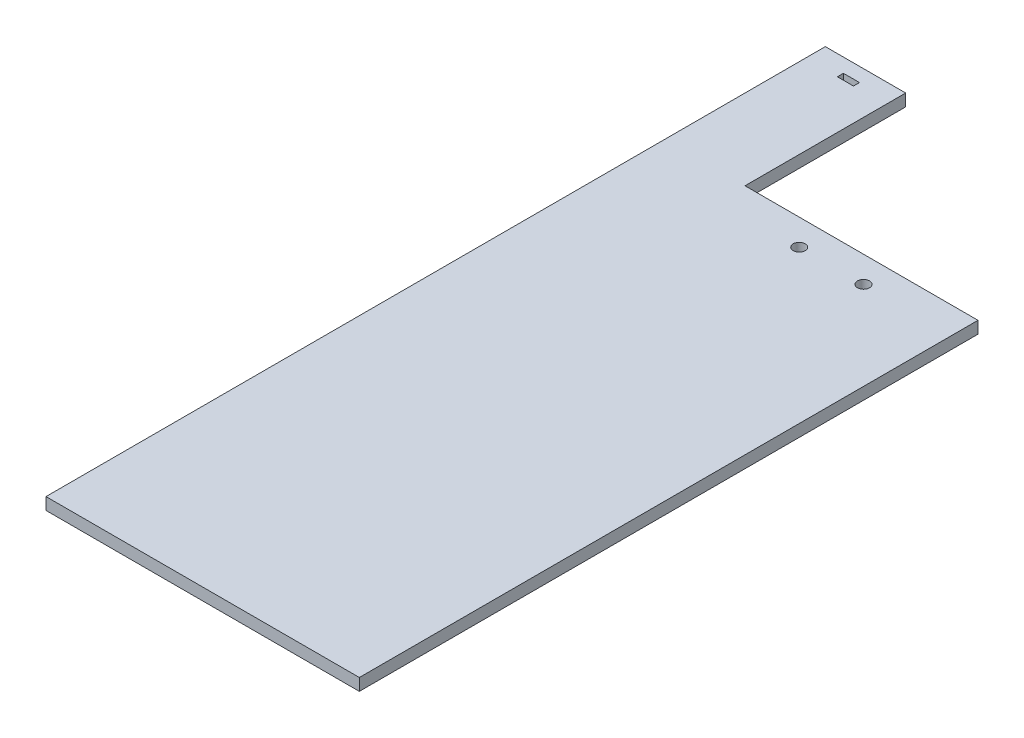
ISO-10303-21;
HEADER;
FILE_DESCRIPTION(('STEP AP214'),'2;1');
FILE_NAME('part.step','',(''),(''),'','','');
FILE_SCHEMA(('AUTOMOTIVE_DESIGN { 1 0 10303 214 1 1 1 1 }'));
ENDSEC;
DATA;
#1=APPLICATION_CONTEXT('core data for automotive mechanical design processes');
#2=APPLICATION_PROTOCOL_DEFINITION('international standard','automotive_design',2000,#1);
#3=PRODUCT_CONTEXT('',#1,'mechanical');
#4=PRODUCT('Part','Part','',(#3));
#5=PRODUCT_RELATED_PRODUCT_CATEGORY('part','',(#4));
#6=PRODUCT_DEFINITION_FORMATION('','',#4);
#7=PRODUCT_DEFINITION_CONTEXT('part definition',#1,'design');
#8=PRODUCT_DEFINITION('design','',#6,#7);
#9=PRODUCT_DEFINITION_SHAPE('','',#8);
#10=(LENGTH_UNIT() NAMED_UNIT(*) SI_UNIT(.MILLI.,.METRE.));
#11=(NAMED_UNIT(*) PLANE_ANGLE_UNIT() SI_UNIT($,.RADIAN.));
#12=(NAMED_UNIT(*) SI_UNIT($,.STERADIAN.) SOLID_ANGLE_UNIT());
#13=UNCERTAINTY_MEASURE_WITH_UNIT(LENGTH_MEASURE(1.E-05),#10,'distance_accuracy_value','');
#14=(GEOMETRIC_REPRESENTATION_CONTEXT(3) GLOBAL_UNCERTAINTY_ASSIGNED_CONTEXT((#13)) GLOBAL_UNIT_ASSIGNED_CONTEXT((#10,
#11,#12)) REPRESENTATION_CONTEXT('',''));
#15=CARTESIAN_POINT('',(0.,0.,0.));
#16=DIRECTION('',(0.,0.,1.));
#17=DIRECTION('',(1.,0.,0.));
#18=AXIS2_PLACEMENT_3D('',#15,#16,#17);
#19=CARTESIAN_POINT('',(0.,3.,0.));
#20=DIRECTION('',(0.,-1.,0.));
#21=DIRECTION('',(0.,0.,-1.));
#22=AXIS2_PLACEMENT_3D('',#19,#20,#21);
#23=PLANE('',#22);
#24=CARTESIAN_POINT('',(40.,3.,-147.5));
#25=DIRECTION('',(0.,1.,0.));
#26=DIRECTION('',(0.,0.,1.));
#27=AXIS2_PLACEMENT_3D('',#24,#25,#26);
#28=CIRCLE('',#27,1.50000000000002);
#29=CARTESIAN_POINT('',(40.,3.,-146.));
#30=VERTEX_POINT('',#29);
#31=EDGE_CURVE('E189',#30,#30,#28,.T.);
#32=ORIENTED_EDGE('',*,*,#31,.F.);
#33=EDGE_LOOP('',(#32));
#34=FACE_BOUND('',#33,.T.);
#35=CARTESIAN_POINT('',(56.,3.,-147.5));
#36=DIRECTION('',(0.,1.,0.));
#37=DIRECTION('',(0.,0.,1.));
#38=AXIS2_PLACEMENT_3D('',#35,#36,#37);
#39=CIRCLE('',#38,1.49999999999998);
#40=CARTESIAN_POINT('',(56.,3.,-146.));
#41=VERTEX_POINT('',#40);
#42=EDGE_CURVE('E196',#41,#41,#39,.T.);
#43=ORIENTED_EDGE('',*,*,#42,.F.);
#44=EDGE_LOOP('',(#43));
#45=FACE_BOUND('',#44,.T.);
#46=DIRECTION('',(1.,0.,0.));
#47=VECTOR('',#46,1.);
#48=CARTESIAN_POINT('',(0.,3.,0.));
#49=LINE('',#48,#47);
#50=CARTESIAN_POINT('',(0.,3.,0.));
#51=VERTEX_POINT('',#50);
#52=CARTESIAN_POINT('',(78.,3.,0.));
#53=VERTEX_POINT('',#52);
#54=EDGE_CURVE('E133',#51,#53,#49,.T.);
#55=ORIENTED_EDGE('',*,*,#54,.T.);
#56=DIRECTION('',(0.,0.,1.));
#57=VECTOR('',#56,1.);
#58=CARTESIAN_POINT('',(78.,3.,-194.));
#59=LINE('',#58,#57);
#60=CARTESIAN_POINT('',(78.,3.,-154.));
#61=VERTEX_POINT('',#60);
#62=EDGE_CURVE('E121',#61,#53,#59,.T.);
#63=ORIENTED_EDGE('',*,*,#62,.F.);
#64=DIRECTION('',(-1.,0.,0.));
#65=VECTOR('',#64,1.);
#66=CARTESIAN_POINT('',(20.,3.,-154.));
#67=LINE('',#66,#65);
#68=CARTESIAN_POINT('',(20.,3.,-154.));
#69=VERTEX_POINT('',#68);
#70=EDGE_CURVE('E144',#61,#69,#67,.T.);
#71=ORIENTED_EDGE('',*,*,#70,.T.);
#72=DIRECTION('',(0.,0.,-1.));
#73=VECTOR('',#72,1.);
#74=CARTESIAN_POINT('',(20.,3.,-194.));
#75=LINE('',#74,#73);
#76=CARTESIAN_POINT('',(20.,3.,-194.));
#77=VERTEX_POINT('',#76);
#78=EDGE_CURVE('E148',#69,#77,#75,.T.);
#79=ORIENTED_EDGE('',*,*,#78,.T.);
#80=DIRECTION('',(-1.,0.,0.));
#81=VECTOR('',#80,1.);
#82=CARTESIAN_POINT('',(0.,3.,-194.));
#83=LINE('',#82,#81);
#84=CARTESIAN_POINT('',(0.,3.,-194.));
#85=VERTEX_POINT('',#84);
#86=EDGE_CURVE('E156',#77,#85,#83,.T.);
#87=ORIENTED_EDGE('',*,*,#86,.T.);
#88=DIRECTION('',(0.,0.,1.));
#89=VECTOR('',#88,1.);
#90=CARTESIAN_POINT('',(0.,3.,0.));
#91=LINE('',#90,#89);
#92=EDGE_CURVE('E141',#85,#51,#91,.T.);
#93=ORIENTED_EDGE('',*,*,#92,.T.);
#94=EDGE_LOOP('',(#55,#63,#71,#79,#87,#93));
#95=FACE_BOUND('',#94,.T.);
#96=DIRECTION('',(0.,0.,1.));
#97=VECTOR('',#96,1.);
#98=CARTESIAN_POINT('',(8.,3.,-190.5));
#99=LINE('',#98,#97);
#100=CARTESIAN_POINT('',(8.,3.,-190.5));
#101=VERTEX_POINT('',#100);
#102=CARTESIAN_POINT('',(8.,3.,-189.));
#103=VERTEX_POINT('',#102);
#104=EDGE_CURVE('E207',#101,#103,#99,.T.);
#105=ORIENTED_EDGE('',*,*,#104,.F.);
#106=DIRECTION('',(-1.,0.,0.));
#107=VECTOR('',#106,1.);
#108=CARTESIAN_POINT('',(8.,3.,-190.5));
#109=LINE('',#108,#107);
#110=CARTESIAN_POINT('',(12.,3.,-190.5));
#111=VERTEX_POINT('',#110);
#112=EDGE_CURVE('E217',#111,#101,#109,.T.);
#113=ORIENTED_EDGE('',*,*,#112,.F.);
#114=DIRECTION('',(0.,0.,-1.));
#115=VECTOR('',#114,1.);
#116=CARTESIAN_POINT('',(12.,3.,-190.5));
#117=LINE('',#116,#115);
#118=CARTESIAN_POINT('',(12.,3.,-189.));
#119=VERTEX_POINT('',#118);
#120=EDGE_CURVE('E214',#119,#111,#117,.T.);
#121=ORIENTED_EDGE('',*,*,#120,.F.);
#122=DIRECTION('',(1.,0.,0.));
#123=VECTOR('',#122,1.);
#124=CARTESIAN_POINT('',(8.,3.,-189.));
#125=LINE('',#124,#123);
#126=EDGE_CURVE('E210',#103,#119,#125,.T.);
#127=ORIENTED_EDGE('',*,*,#126,.F.);
#128=EDGE_LOOP('',(#105,#113,#121,#127));
#129=FACE_BOUND('',#128,.T.);
#130=ADVANCED_FACE('F44',(#34,#45,#95,#129),#23,.F.);
#131=CARTESIAN_POINT('',(0.,0.,0.));
#132=DIRECTION('',(0.,-1.,0.));
#133=DIRECTION('',(0.,0.,-1.));
#134=AXIS2_PLACEMENT_3D('',#131,#132,#133);
#135=PLANE('',#134);
#136=CARTESIAN_POINT('',(40.,0.,-147.5));
#137=DIRECTION('',(0.,-1.,0.));
#138=DIRECTION('',(0.,0.,-1.));
#139=AXIS2_PLACEMENT_3D('',#136,#137,#138);
#140=CIRCLE('',#139,1.50000000000002);
#141=CARTESIAN_POINT('',(40.,0.,-149.));
#142=VERTEX_POINT('',#141);
#143=EDGE_CURVE('E48',#142,#142,#140,.T.);
#144=ORIENTED_EDGE('',*,*,#143,.F.);
#145=EDGE_LOOP('',(#144));
#146=FACE_BOUND('',#145,.T.);
#147=CARTESIAN_POINT('',(56.,0.,-147.5));
#148=DIRECTION('',(0.,-1.,0.));
#149=DIRECTION('',(0.,0.,-1.));
#150=AXIS2_PLACEMENT_3D('',#147,#148,#149);
#151=CIRCLE('',#150,1.49999999999998);
#152=CARTESIAN_POINT('',(56.,0.,-149.));
#153=VERTEX_POINT('',#152);
#154=EDGE_CURVE('E186',#153,#153,#151,.T.);
#155=ORIENTED_EDGE('',*,*,#154,.F.);
#156=EDGE_LOOP('',(#155));
#157=FACE_BOUND('',#156,.T.);
#158=DIRECTION('',(0.,0.,1.));
#159=VECTOR('',#158,1.);
#160=CARTESIAN_POINT('',(78.,0.,-194.));
#161=LINE('',#160,#159);
#162=CARTESIAN_POINT('',(78.,0.,-154.));
#163=VERTEX_POINT('',#162);
#164=CARTESIAN_POINT('',(78.,0.,0.));
#165=VERTEX_POINT('',#164);
#166=EDGE_CURVE('E62',#163,#165,#161,.T.);
#167=ORIENTED_EDGE('',*,*,#166,.T.);
#168=DIRECTION('',(1.,0.,0.));
#169=VECTOR('',#168,1.);
#170=CARTESIAN_POINT('',(0.,0.,0.));
#171=LINE('',#170,#169);
#172=CARTESIAN_POINT('',(0.,0.,0.));
#173=VERTEX_POINT('',#172);
#174=EDGE_CURVE('E136',#173,#165,#171,.T.);
#175=ORIENTED_EDGE('',*,*,#174,.F.);
#176=DIRECTION('',(0.,0.,1.));
#177=VECTOR('',#176,1.);
#178=CARTESIAN_POINT('',(0.,0.,-154.));
#179=LINE('',#178,#177);
#180=CARTESIAN_POINT('',(0.,0.,-194.));
#181=VERTEX_POINT('',#180);
#182=EDGE_CURVE('E150',#181,#173,#179,.T.);
#183=ORIENTED_EDGE('',*,*,#182,.F.);
#184=DIRECTION('',(-1.,0.,0.));
#185=VECTOR('',#184,1.);
#186=CARTESIAN_POINT('',(0.,0.,-194.));
#187=LINE('',#186,#185);
#188=CARTESIAN_POINT('',(20.,0.,-194.));
#189=VERTEX_POINT('',#188);
#190=EDGE_CURVE('E169',#189,#181,#187,.T.);
#191=ORIENTED_EDGE('',*,*,#190,.F.);
#192=DIRECTION('',(0.,0.,-1.));
#193=VECTOR('',#192,1.);
#194=CARTESIAN_POINT('',(20.,0.,-194.));
#195=LINE('',#194,#193);
#196=CARTESIAN_POINT('',(20.,0.,-154.));
#197=VERTEX_POINT('',#196);
#198=EDGE_CURVE('E166',#197,#189,#195,.T.);
#199=ORIENTED_EDGE('',*,*,#198,.F.);
#200=DIRECTION('',(-1.,0.,0.));
#201=VECTOR('',#200,1.);
#202=CARTESIAN_POINT('',(20.,0.,-154.));
#203=LINE('',#202,#201);
#204=EDGE_CURVE('E162',#163,#197,#203,.T.);
#205=ORIENTED_EDGE('',*,*,#204,.F.);
#206=EDGE_LOOP('',(#167,#175,#183,#191,#199,#205));
#207=FACE_BOUND('',#206,.T.);
#208=DIRECTION('',(-1.,0.,0.));
#209=VECTOR('',#208,1.);
#210=CARTESIAN_POINT('',(8.,0.,-190.5));
#211=LINE('',#210,#209);
#212=CARTESIAN_POINT('',(12.,0.,-190.5));
#213=VERTEX_POINT('',#212);
#214=CARTESIAN_POINT('',(8.,0.,-190.5));
#215=VERTEX_POINT('',#214);
#216=EDGE_CURVE('E211',#213,#215,#211,.T.);
#217=ORIENTED_EDGE('',*,*,#216,.T.);
#218=DIRECTION('',(0.,0.,1.));
#219=VECTOR('',#218,1.);
#220=CARTESIAN_POINT('',(8.,0.,-190.5));
#221=LINE('',#220,#219);
#222=CARTESIAN_POINT('',(8.,0.,-189.));
#223=VERTEX_POINT('',#222);
#224=EDGE_CURVE('E205',#215,#223,#221,.T.);
#225=ORIENTED_EDGE('',*,*,#224,.T.);
#226=DIRECTION('',(1.,0.,0.));
#227=VECTOR('',#226,1.);
#228=CARTESIAN_POINT('',(8.,0.,-189.));
#229=LINE('',#228,#227);
#230=CARTESIAN_POINT('',(12.,0.,-189.));
#231=VERTEX_POINT('',#230);
#232=EDGE_CURVE('E224',#223,#231,#229,.T.);
#233=ORIENTED_EDGE('',*,*,#232,.T.);
#234=DIRECTION('',(0.,0.,-1.));
#235=VECTOR('',#234,1.);
#236=CARTESIAN_POINT('',(12.,0.,-190.5));
#237=LINE('',#236,#235);
#238=EDGE_CURVE('E228',#231,#213,#237,.T.);
#239=ORIENTED_EDGE('',*,*,#238,.T.);
#240=EDGE_LOOP('',(#217,#225,#233,#239));
#241=FACE_BOUND('',#240,.T.);
#242=ADVANCED_FACE('F252',(#146,#157,#207,#241),#135,.T.);
#243=CARTESIAN_POINT('',(0.,3.,0.));
#244=DIRECTION('',(0.,0.,-1.));
#245=DIRECTION('',(-1.,0.,0.));
#246=AXIS2_PLACEMENT_3D('',#243,#244,#245);
#247=PLANE('',#246);
#248=ORIENTED_EDGE('',*,*,#174,.T.);
#249=DIRECTION('',(0.,-1.,0.));
#250=VECTOR('',#249,1.);
#251=CARTESIAN_POINT('',(78.,0.,0.));
#252=LINE('',#251,#250);
#253=EDGE_CURVE('E124',#53,#165,#252,.T.);
#254=ORIENTED_EDGE('',*,*,#253,.F.);
#255=ORIENTED_EDGE('',*,*,#54,.F.);
#256=DIRECTION('',(0.,-1.,0.));
#257=VECTOR('',#256,1.);
#258=CARTESIAN_POINT('',(0.,3.,0.));
#259=LINE('',#258,#257);
#260=EDGE_CURVE('E54',#51,#173,#259,.T.);
#261=ORIENTED_EDGE('',*,*,#260,.T.);
#262=EDGE_LOOP('',(#248,#254,#255,#261));
#263=FACE_BOUND('',#262,.T.);
#264=ADVANCED_FACE('F46',(#263),#247,.F.);
#265=CARTESIAN_POINT('',(20.,3.,-154.));
#266=DIRECTION('',(0.,0.,1.));
#267=DIRECTION('',(1.,0.,0.));
#268=AXIS2_PLACEMENT_3D('',#265,#266,#267);
#269=PLANE('',#268);
#270=ORIENTED_EDGE('',*,*,#70,.F.);
#271=DIRECTION('',(0.,-1.,0.));
#272=VECTOR('',#271,1.);
#273=CARTESIAN_POINT('',(78.,3.,-154.));
#274=LINE('',#273,#272);
#275=EDGE_CURVE('E11',#61,#163,#274,.T.);
#276=ORIENTED_EDGE('',*,*,#275,.T.);
#277=ORIENTED_EDGE('',*,*,#204,.T.);
#278=DIRECTION('',(0.,-1.,0.));
#279=VECTOR('',#278,1.);
#280=CARTESIAN_POINT('',(20.,3.,-154.));
#281=LINE('',#280,#279);
#282=EDGE_CURVE('E181',#69,#197,#281,.T.);
#283=ORIENTED_EDGE('',*,*,#282,.F.);
#284=EDGE_LOOP('',(#270,#276,#277,#283));
#285=FACE_BOUND('',#284,.T.);
#286=ADVANCED_FACE('F291',(#285),#269,.F.);
#287=CARTESIAN_POINT('',(20.,3.,-194.));
#288=DIRECTION('',(-1.,0.,0.));
#289=DIRECTION('',(0.,0.,1.));
#290=AXIS2_PLACEMENT_3D('',#287,#288,#289);
#291=PLANE('',#290);
#292=ORIENTED_EDGE('',*,*,#198,.T.);
#293=DIRECTION('',(0.,-1.,0.));
#294=VECTOR('',#293,1.);
#295=CARTESIAN_POINT('',(20.,3.,-194.));
#296=LINE('',#295,#294);
#297=EDGE_CURVE('E177',#77,#189,#296,.T.);
#298=ORIENTED_EDGE('',*,*,#297,.F.);
#299=ORIENTED_EDGE('',*,*,#78,.F.);
#300=ORIENTED_EDGE('',*,*,#282,.T.);
#301=EDGE_LOOP('',(#292,#298,#299,#300));
#302=FACE_BOUND('',#301,.T.);
#303=ADVANCED_FACE('F288',(#302),#291,.F.);
#304=CARTESIAN_POINT('',(0.,3.,-194.));
#305=DIRECTION('',(0.,0.,1.));
#306=DIRECTION('',(1.,0.,0.));
#307=AXIS2_PLACEMENT_3D('',#304,#305,#306);
#308=PLANE('',#307);
#309=ORIENTED_EDGE('',*,*,#190,.T.);
#310=DIRECTION('',(0.,-1.,0.));
#311=VECTOR('',#310,1.);
#312=CARTESIAN_POINT('',(0.,3.,-194.));
#313=LINE('',#312,#311);
#314=EDGE_CURVE('E159',#85,#181,#313,.T.);
#315=ORIENTED_EDGE('',*,*,#314,.F.);
#316=ORIENTED_EDGE('',*,*,#86,.F.);
#317=ORIENTED_EDGE('',*,*,#297,.T.);
#318=EDGE_LOOP('',(#309,#315,#316,#317));
#319=FACE_BOUND('',#318,.T.);
#320=ADVANCED_FACE('F284',(#319),#308,.F.);
#321=CARTESIAN_POINT('',(0.,3.,-154.));
#322=DIRECTION('',(1.,0.,0.));
#323=DIRECTION('',(0.,0.,-1.));
#324=AXIS2_PLACEMENT_3D('',#321,#322,#323);
#325=PLANE('',#324);
#326=ORIENTED_EDGE('',*,*,#182,.T.);
#327=ORIENTED_EDGE('',*,*,#260,.F.);
#328=ORIENTED_EDGE('',*,*,#92,.F.);
#329=ORIENTED_EDGE('',*,*,#314,.T.);
#330=EDGE_LOOP('',(#326,#327,#328,#329));
#331=FACE_BOUND('',#330,.T.);
#332=ADVANCED_FACE('F281',(#331),#325,.F.);
#333=CARTESIAN_POINT('',(8.,3.,-190.5));
#334=DIRECTION('',(1.,0.,0.));
#335=DIRECTION('',(0.,0.,-1.));
#336=AXIS2_PLACEMENT_3D('',#333,#334,#335);
#337=PLANE('',#336);
#338=ORIENTED_EDGE('',*,*,#224,.F.);
#339=DIRECTION('',(0.,-1.,0.));
#340=VECTOR('',#339,1.);
#341=CARTESIAN_POINT('',(8.,3.,-190.5));
#342=LINE('',#341,#340);
#343=EDGE_CURVE('E220',#101,#215,#342,.T.);
#344=ORIENTED_EDGE('',*,*,#343,.F.);
#345=ORIENTED_EDGE('',*,*,#104,.T.);
#346=DIRECTION('',(0.,-1.,0.));
#347=VECTOR('',#346,1.);
#348=CARTESIAN_POINT('',(8.,3.,-189.));
#349=LINE('',#348,#347);
#350=EDGE_CURVE('E163',#103,#223,#349,.T.);
#351=ORIENTED_EDGE('',*,*,#350,.T.);
#352=EDGE_LOOP('',(#338,#344,#345,#351));
#353=FACE_BOUND('',#352,.T.);
#354=ADVANCED_FACE('F246',(#353),#337,.T.);
#355=CARTESIAN_POINT('',(8.,3.,-189.));
#356=DIRECTION('',(0.,0.,-1.));
#357=DIRECTION('',(-1.,0.,0.));
#358=AXIS2_PLACEMENT_3D('',#355,#356,#357);
#359=PLANE('',#358);
#360=ORIENTED_EDGE('',*,*,#232,.F.);
#361=ORIENTED_EDGE('',*,*,#350,.F.);
#362=ORIENTED_EDGE('',*,*,#126,.T.);
#363=DIRECTION('',(0.,-1.,0.));
#364=VECTOR('',#363,1.);
#365=CARTESIAN_POINT('',(12.,3.,-189.));
#366=LINE('',#365,#364);
#367=EDGE_CURVE('E240',#119,#231,#366,.T.);
#368=ORIENTED_EDGE('',*,*,#367,.T.);
#369=EDGE_LOOP('',(#360,#361,#362,#368));
#370=FACE_BOUND('',#369,.T.);
#371=ADVANCED_FACE('F258',(#370),#359,.T.);
#372=CARTESIAN_POINT('',(12.,3.,-190.5));
#373=DIRECTION('',(-1.,0.,0.));
#374=DIRECTION('',(0.,0.,1.));
#375=AXIS2_PLACEMENT_3D('',#372,#373,#374);
#376=PLANE('',#375);
#377=ORIENTED_EDGE('',*,*,#238,.F.);
#378=ORIENTED_EDGE('',*,*,#367,.F.);
#379=ORIENTED_EDGE('',*,*,#120,.T.);
#380=DIRECTION('',(0.,-1.,0.));
#381=VECTOR('',#380,1.);
#382=CARTESIAN_POINT('',(12.,3.,-190.5));
#383=LINE('',#382,#381);
#384=EDGE_CURVE('E69',#111,#213,#383,.T.);
#385=ORIENTED_EDGE('',*,*,#384,.T.);
#386=EDGE_LOOP('',(#377,#378,#379,#385));
#387=FACE_BOUND('',#386,.T.);
#388=ADVANCED_FACE('F260',(#387),#376,.T.);
#389=CARTESIAN_POINT('',(8.,3.,-190.5));
#390=DIRECTION('',(0.,0.,1.));
#391=DIRECTION('',(1.,0.,0.));
#392=AXIS2_PLACEMENT_3D('',#389,#390,#391);
#393=PLANE('',#392);
#394=ORIENTED_EDGE('',*,*,#216,.F.);
#395=ORIENTED_EDGE('',*,*,#384,.F.);
#396=ORIENTED_EDGE('',*,*,#112,.T.);
#397=ORIENTED_EDGE('',*,*,#343,.T.);
#398=EDGE_LOOP('',(#394,#395,#396,#397));
#399=FACE_BOUND('',#398,.T.);
#400=ADVANCED_FACE('F254',(#399),#393,.T.);
#401=CARTESIAN_POINT('',(78.,0.,-194.));
#402=DIRECTION('',(-1.,0.,0.));
#403=DIRECTION('',(0.,0.,1.));
#404=AXIS2_PLACEMENT_3D('',#401,#402,#403);
#405=PLANE('',#404);
#406=ORIENTED_EDGE('',*,*,#62,.T.);
#407=ORIENTED_EDGE('',*,*,#253,.T.);
#408=ORIENTED_EDGE('',*,*,#166,.F.);
#409=ORIENTED_EDGE('',*,*,#275,.F.);
#410=EDGE_LOOP('',(#406,#407,#408,#409));
#411=FACE_BOUND('',#410,.T.);
#412=ADVANCED_FACE('F123',(#411),#405,.F.);
#413=CARTESIAN_POINT('',(56.,-7.,-147.5));
#414=DIRECTION('',(0.,1.,0.));
#415=DIRECTION('',(0.,0.,1.));
#416=AXIS2_PLACEMENT_3D('',#413,#414,#415);
#417=CYLINDRICAL_SURFACE('',#416,1.49999999999998);
#418=ORIENTED_EDGE('',*,*,#154,.T.);
#419=EDGE_LOOP('',(#418));
#420=FACE_BOUND('',#419,.T.);
#421=ORIENTED_EDGE('',*,*,#42,.T.);
#422=EDGE_LOOP('',(#421));
#423=FACE_BOUND('',#422,.T.);
#424=ADVANCED_FACE('F329',(#420,#423),#417,.F.);
#425=CARTESIAN_POINT('',(40.,-7.,-147.5));
#426=DIRECTION('',(0.,1.,0.));
#427=DIRECTION('',(0.,0.,1.));
#428=AXIS2_PLACEMENT_3D('',#425,#426,#427);
#429=CYLINDRICAL_SURFACE('',#428,1.50000000000002);
#430=ORIENTED_EDGE('',*,*,#143,.T.);
#431=EDGE_LOOP('',(#430));
#432=FACE_BOUND('',#431,.T.);
#433=ORIENTED_EDGE('',*,*,#31,.T.);
#434=EDGE_LOOP('',(#433));
#435=FACE_BOUND('',#434,.T.);
#436=ADVANCED_FACE('F338',(#432,#435),#429,.F.);
#437=CLOSED_SHELL('',(#130,#242,#264,#286,#303,#320,#332,#354,#371,#388,#400,#412,#424,#436));
#438=MANIFOLD_SOLID_BREP('B2',#437);
#439=ADVANCED_BREP_SHAPE_REPRESENTATION('',(#18,#438),#14);
#440=SHAPE_DEFINITION_REPRESENTATION(#9,#439);
ENDSEC;
END-ISO-10303-21;
